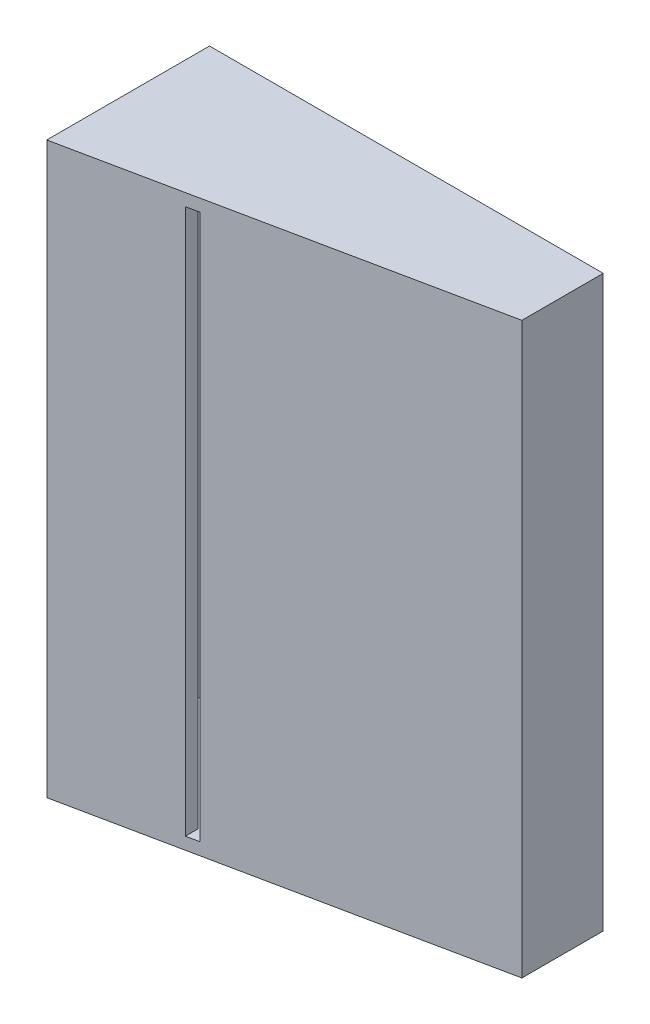
ISO-10303-21;
HEADER;
FILE_DESCRIPTION(('STEP AP214'),'2;1');
FILE_NAME('part.step','',(''),(''),'','','');
FILE_SCHEMA(('AUTOMOTIVE_DESIGN { 1 0 10303 214 1 1 1 1 }'));
ENDSEC;
DATA;
#1=APPLICATION_CONTEXT('core data for automotive mechanical design processes');
#2=APPLICATION_PROTOCOL_DEFINITION('international standard','automotive_design',2000,#1);
#3=PRODUCT_CONTEXT('',#1,'mechanical');
#4=PRODUCT('Part','Part','',(#3));
#5=PRODUCT_RELATED_PRODUCT_CATEGORY('part','',(#4));
#6=PRODUCT_DEFINITION_FORMATION('','',#4);
#7=PRODUCT_DEFINITION_CONTEXT('part definition',#1,'design');
#8=PRODUCT_DEFINITION('design','',#6,#7);
#9=PRODUCT_DEFINITION_SHAPE('','',#8);
#10=(LENGTH_UNIT() NAMED_UNIT(*) SI_UNIT(.MILLI.,.METRE.));
#11=(NAMED_UNIT(*) PLANE_ANGLE_UNIT() SI_UNIT($,.RADIAN.));
#12=(NAMED_UNIT(*) SI_UNIT($,.STERADIAN.) SOLID_ANGLE_UNIT());
#13=UNCERTAINTY_MEASURE_WITH_UNIT(LENGTH_MEASURE(1.E-05),#10,'distance_accuracy_value','');
#14=(GEOMETRIC_REPRESENTATION_CONTEXT(3) GLOBAL_UNCERTAINTY_ASSIGNED_CONTEXT((#13)) GLOBAL_UNIT_ASSIGNED_CONTEXT((#10,
#11,#12)) REPRESENTATION_CONTEXT('',''));
#15=CARTESIAN_POINT('',(0.,0.,0.));
#16=DIRECTION('',(0.,0.,1.));
#17=DIRECTION('',(1.,0.,0.));
#18=AXIS2_PLACEMENT_3D('',#15,#16,#17);
#19=CARTESIAN_POINT('',(0.,75.1134184450822,8.77829955942792));
#20=DIRECTION('',(0.202388113855783,0.,0.979305392290831));
#21=DIRECTION('',(0.979305392290831,0.,-0.202388113855783));
#22=AXIS2_PLACEMENT_3D('',#19,#20,#21);
#23=PLANE('',#22);
#24=DIRECTION('',(-0.979305392290831,0.,0.202388113855783));
#25=VECTOR('',#24,1.);
#26=CARTESIAN_POINT('',(0.,-8.25000000000003,8.77829955942792));
#27=LINE('',#26,#25);
#28=CARTESIAN_POINT('',(0.,-8.25000000000003,8.77829955942792));
#29=VERTEX_POINT('',#28);
#30=CARTESIAN_POINT('',(-31.27,-8.25000000000003,15.2407129905089));
#31=VERTEX_POINT('',#30);
#32=EDGE_CURVE('E264',#29,#31,#27,.T.);
#33=ORIENTED_EDGE('',*,*,#32,.T.);
#34=DIRECTION('',(0.,1.,0.));
#35=VECTOR('',#34,1.);
#36=CARTESIAN_POINT('',(-31.27,75.1134184450822,15.2407129905089));
#37=LINE('',#36,#35);
#38=CARTESIAN_POINT('',(-31.27,58.7499999999998,15.2407129905089));
#39=VERTEX_POINT('',#38);
#40=EDGE_CURVE('E242',#31,#39,#37,.T.);
#41=ORIENTED_EDGE('',*,*,#40,.T.);
#42=DIRECTION('',(-0.979305392290831,0.,0.202388113855783));
#43=VECTOR('',#42,1.);
#44=CARTESIAN_POINT('',(0.,58.7499999999998,8.77829955942792));
#45=LINE('',#44,#43);
#46=CARTESIAN_POINT('',(0.,58.7499999999998,8.77829955942792));
#47=VERTEX_POINT('',#46);
#48=EDGE_CURVE('E253',#47,#39,#45,.T.);
#49=ORIENTED_EDGE('',*,*,#48,.F.);
#50=DIRECTION('',(0.,-1.,0.));
#51=VECTOR('',#50,1.);
#52=CARTESIAN_POINT('',(0.,75.1134184450822,8.77829955942792));
#53=LINE('',#52,#51);
#54=EDGE_CURVE('E263',#47,#29,#53,.T.);
#55=ORIENTED_EDGE('',*,*,#54,.T.);
#56=EDGE_LOOP('',(#33,#41,#49,#55));
#57=FACE_BOUND('',#56,.T.);
#58=ADVANCED_FACE('F33',(#57),#23,.F.);
#59=CARTESIAN_POINT('',(-46.8874953737975,75.1134184450822,1.5));
#60=DIRECTION('',(0.,0.,-1.));
#61=DIRECTION('',(-1.,0.,0.));
#62=AXIS2_PLACEMENT_3D('',#59,#60,#61);
#63=PLANE('',#62);
#64=DIRECTION('',(1.,0.,0.));
#65=VECTOR('',#64,1.);
#66=CARTESIAN_POINT('',(-46.8874953737975,58.7499999999998,1.5));
#67=LINE('',#66,#65);
#68=CARTESIAN_POINT('',(-31.27,58.7499999999998,1.5));
#69=VERTEX_POINT('',#68);
#70=CARTESIAN_POINT('',(0.,58.7499999999998,1.5));
#71=VERTEX_POINT('',#70);
#72=EDGE_CURVE('E245',#69,#71,#67,.T.);
#73=ORIENTED_EDGE('',*,*,#72,.F.);
#74=DIRECTION('',(0.,-1.,0.));
#75=VECTOR('',#74,1.);
#76=CARTESIAN_POINT('',(-31.27,75.1134184450822,1.5));
#77=LINE('',#76,#75);
#78=CARTESIAN_POINT('',(-31.27,-8.25000000000002,1.5));
#79=VERTEX_POINT('',#78);
#80=EDGE_CURVE('E239',#69,#79,#77,.T.);
#81=ORIENTED_EDGE('',*,*,#80,.T.);
#82=DIRECTION('',(1.,0.,0.));
#83=VECTOR('',#82,1.);
#84=CARTESIAN_POINT('',(-46.8874953737975,-8.25000000000003,1.5));
#85=LINE('',#84,#83);
#86=CARTESIAN_POINT('',(0.,-8.25000000000003,1.5));
#87=VERTEX_POINT('',#86);
#88=EDGE_CURVE('E259',#79,#87,#85,.T.);
#89=ORIENTED_EDGE('',*,*,#88,.T.);
#90=DIRECTION('',(0.,-1.,0.));
#91=VECTOR('',#90,1.);
#92=CARTESIAN_POINT('',(0.,75.1134184450822,1.5));
#93=LINE('',#92,#91);
#94=EDGE_CURVE('E275',#71,#87,#93,.T.);
#95=ORIENTED_EDGE('',*,*,#94,.F.);
#96=EDGE_LOOP('',(#73,#81,#89,#95));
#97=FACE_BOUND('',#96,.T.);
#98=ADVANCED_FACE('F425',(#97),#63,.F.);
#99=CARTESIAN_POINT('',(-46.8874953737956,15.3499999999999,-21.511246837716));
#100=DIRECTION('',(-1.,0.,0.));
#101=DIRECTION('',(0.,-1.,0.));
#102=AXIS2_PLACEMENT_3D('',#99,#100,#101);
#103=PLANE('',#102);
#104=DIRECTION('',(0.,0.,1.));
#105=VECTOR('',#104,1.);
#106=CARTESIAN_POINT('',(-46.8874953737956,35.1499999999999,-21.511246837716));
#107=LINE('',#106,#105);
#108=CARTESIAN_POINT('',(-46.8874953737956,35.1499999999999,-1.49999999999997));
#109=VERTEX_POINT('',#108);
#110=CARTESIAN_POINT('',(-46.8874953737956,35.1499999999999,0.));
#111=VERTEX_POINT('',#110);
#112=EDGE_CURVE('E37',#109,#111,#107,.T.);
#113=ORIENTED_EDGE('',*,*,#112,.F.);
#114=DIRECTION('',(0.,1.,0.));
#115=VECTOR('',#114,1.);
#116=CARTESIAN_POINT('',(-46.8874953737956,12.2499999999999,-1.49999999999997));
#117=LINE('',#116,#115);
#118=CARTESIAN_POINT('',(-46.8874953737956,38.2499999999999,-1.49999999999997));
#119=VERTEX_POINT('',#118);
#120=EDGE_CURVE('E314',#109,#119,#117,.T.);
#121=ORIENTED_EDGE('',*,*,#120,.T.);
#122=DIRECTION('',(0.,0.,1.));
#123=VECTOR('',#122,1.);
#124=CARTESIAN_POINT('',(-46.8874953737956,38.2499999999999,-2.99999999999997));
#125=LINE('',#124,#123);
#126=CARTESIAN_POINT('',(-46.8874953737956,38.2499999999999,-2.99999999999997));
#127=VERTEX_POINT('',#126);
#128=EDGE_CURVE('E342',#127,#119,#125,.T.);
#129=ORIENTED_EDGE('',*,*,#128,.F.);
#130=DIRECTION('',(0.,1.,0.));
#131=VECTOR('',#130,1.);
#132=CARTESIAN_POINT('',(-46.8874953737956,12.2499999999999,-2.99999999999997));
#133=LINE('',#132,#131);
#134=CARTESIAN_POINT('',(-46.8874953737956,12.2499999999999,-2.99999999999997));
#135=VERTEX_POINT('',#134);
#136=EDGE_CURVE('E315',#135,#127,#133,.T.);
#137=ORIENTED_EDGE('',*,*,#136,.F.);
#138=DIRECTION('',(0.,0.,1.));
#139=VECTOR('',#138,1.);
#140=CARTESIAN_POINT('',(-46.8874953737956,12.2499999999999,-2.99999999999997));
#141=LINE('',#140,#139);
#142=CARTESIAN_POINT('',(-46.8874953737956,12.2499999999999,-1.49999999999997));
#143=VERTEX_POINT('',#142);
#144=EDGE_CURVE('E325',#135,#143,#141,.T.);
#145=ORIENTED_EDGE('',*,*,#144,.T.);
#146=CARTESIAN_POINT('',(-46.8874953737956,15.3499999999999,-1.49999999999997));
#147=VERTEX_POINT('',#146);
#148=EDGE_CURVE('E326',#143,#147,#117,.T.);
#149=ORIENTED_EDGE('',*,*,#148,.T.);
#150=DIRECTION('',(0.,0.,1.));
#151=VECTOR('',#150,1.);
#152=CARTESIAN_POINT('',(-46.8874953737956,15.3499999999999,-21.511246837716));
#153=LINE('',#152,#151);
#154=CARTESIAN_POINT('',(-46.8874953737956,15.3499999999999,0.));
#155=VERTEX_POINT('',#154);
#156=EDGE_CURVE('E363',#147,#155,#153,.T.);
#157=ORIENTED_EDGE('',*,*,#156,.T.);
#158=DIRECTION('',(0.,-1.,0.));
#159=VECTOR('',#158,1.);
#160=CARTESIAN_POINT('',(-46.8874953737956,15.2499999999999,0.));
#161=LINE('',#160,#159);
#162=CARTESIAN_POINT('',(-46.8874953737975,-9.75000000000003,0.));
#163=VERTEX_POINT('',#162);
#164=EDGE_CURVE('E302',#155,#163,#161,.T.);
#165=ORIENTED_EDGE('',*,*,#164,.T.);
#166=DIRECTION('',(0.,0.,-1.));
#167=VECTOR('',#166,1.);
#168=CARTESIAN_POINT('',(-46.8874953737975,-9.75000000000003,20.));
#169=LINE('',#168,#167);
#170=CARTESIAN_POINT('',(-46.8874953737975,-9.75000000000003,20.));
#171=VERTEX_POINT('',#170);
#172=EDGE_CURVE('E311',#171,#163,#169,.T.);
#173=ORIENTED_EDGE('',*,*,#172,.F.);
#174=DIRECTION('',(0.,-1.,0.));
#175=VECTOR('',#174,1.);
#176=CARTESIAN_POINT('',(-46.8874953737956,15.2499999999999,20.));
#177=LINE('',#176,#175);
#178=CARTESIAN_POINT('',(-46.8874953737966,60.2499999999998,20.));
#179=VERTEX_POINT('',#178);
#180=EDGE_CURVE('E290',#179,#171,#177,.T.);
#181=ORIENTED_EDGE('',*,*,#180,.F.);
#182=DIRECTION('',(0.,0.,-1.));
#183=VECTOR('',#182,1.);
#184=CARTESIAN_POINT('',(-46.8874953737966,60.2499999999998,20.));
#185=LINE('',#184,#183);
#186=CARTESIAN_POINT('',(-46.8874953737966,60.2499999999998,0.));
#187=VERTEX_POINT('',#186);
#188=EDGE_CURVE('E292',#179,#187,#185,.T.);
#189=ORIENTED_EDGE('',*,*,#188,.T.);
#190=EDGE_CURVE('E293',#187,#111,#161,.T.);
#191=ORIENTED_EDGE('',*,*,#190,.T.);
#192=EDGE_LOOP('',(#113,#121,#129,#137,#145,#149,#157,#165,#173,#181,#189,#191));
#193=FACE_BOUND('',#192,.T.);
#194=DIRECTION('',(0.,0.,-1.));
#195=VECTOR('',#194,1.);
#196=CARTESIAN_POINT('',(-46.8874953737975,58.7499999999998,18.4683021131017));
#197=LINE('',#196,#195);
#198=CARTESIAN_POINT('',(-46.8874953737975,58.7499999999998,18.4683021131017));
#199=VERTEX_POINT('',#198);
#200=CARTESIAN_POINT('',(-46.8874953737975,58.7499999999998,1.5));
#201=VERTEX_POINT('',#200);
#202=EDGE_CURVE('E249',#199,#201,#197,.T.);
#203=ORIENTED_EDGE('',*,*,#202,.F.);
#204=DIRECTION('',(0.,-1.,0.));
#205=VECTOR('',#204,1.);
#206=CARTESIAN_POINT('',(-46.8874953737975,75.1134184450822,18.4683021131017));
#207=LINE('',#206,#205);
#208=CARTESIAN_POINT('',(-46.8874953737975,-8.25000000000003,18.4683021131017));
#209=VERTEX_POINT('',#208);
#210=EDGE_CURVE('E276',#199,#209,#207,.T.);
#211=ORIENTED_EDGE('',*,*,#210,.T.);
#212=DIRECTION('',(0.,0.,-1.));
#213=VECTOR('',#212,1.);
#214=CARTESIAN_POINT('',(-46.8874953737975,-8.25000000000003,18.4683021131017));
#215=LINE('',#214,#213);
#216=CARTESIAN_POINT('',(-46.8874953737975,-8.25000000000003,1.5));
#217=VERTEX_POINT('',#216);
#218=EDGE_CURVE('E260',#209,#217,#215,.T.);
#219=ORIENTED_EDGE('',*,*,#218,.T.);
#220=DIRECTION('',(0.,-1.,0.));
#221=VECTOR('',#220,1.);
#222=CARTESIAN_POINT('',(-46.8874953737975,75.1134184450822,1.5));
#223=LINE('',#222,#221);
#224=EDGE_CURVE('E273',#201,#217,#223,.T.);
#225=ORIENTED_EDGE('',*,*,#224,.F.);
#226=EDGE_LOOP('',(#203,#211,#219,#225));
#227=FACE_BOUND('',#226,.T.);
#228=ADVANCED_FACE('F372',(#193,#227),#103,.T.);
#229=CARTESIAN_POINT('',(-46.8874953737956,35.1499999999999,-21.511246837716));
#230=DIRECTION('',(0.,1.,0.));
#231=DIRECTION('',(0.,0.,1.));
#232=AXIS2_PLACEMENT_3D('',#229,#230,#231);
#233=PLANE('',#232);
#234=DIRECTION('',(1.,0.,0.));
#235=VECTOR('',#234,1.);
#236=CARTESIAN_POINT('',(-46.8874953737956,35.1499999999999,-1.49999999999997));
#237=LINE('',#236,#235);
#238=CARTESIAN_POINT('',(-43.9874953737956,35.1499999999999,-1.49999999999997));
#239=VERTEX_POINT('',#238);
#240=EDGE_CURVE('E11',#109,#239,#237,.T.);
#241=ORIENTED_EDGE('',*,*,#240,.F.);
#242=ORIENTED_EDGE('',*,*,#112,.T.);
#243=DIRECTION('',(-1.,0.,0.));
#244=VECTOR('',#243,1.);
#245=CARTESIAN_POINT('',(-46.8874953737956,35.1499999999999,0.));
#246=LINE('',#245,#244);
#247=CARTESIAN_POINT('',(-43.9874953737956,35.1499999999999,0.));
#248=VERTEX_POINT('',#247);
#249=EDGE_CURVE('E345',#248,#111,#246,.T.);
#250=ORIENTED_EDGE('',*,*,#249,.F.);
#251=DIRECTION('',(0.,0.,1.));
#252=VECTOR('',#251,1.);
#253=CARTESIAN_POINT('',(-43.9874953737956,35.1499999999999,-21.511246837716));
#254=LINE('',#253,#252);
#255=EDGE_CURVE('E349',#239,#248,#254,.T.);
#256=ORIENTED_EDGE('',*,*,#255,.F.);
#257=EDGE_LOOP('',(#241,#242,#250,#256));
#258=FACE_BOUND('',#257,.T.);
#259=ADVANCED_FACE('F35',(#258),#233,.T.);
#260=CARTESIAN_POINT('',(-43.9874953737956,35.1499999999999,-21.511246837716));
#261=DIRECTION('',(1.,0.,0.));
#262=DIRECTION('',(0.,0.,-1.));
#263=AXIS2_PLACEMENT_3D('',#260,#261,#262);
#264=PLANE('',#263);
#265=DIRECTION('',(0.,-1.,0.));
#266=VECTOR('',#265,1.);
#267=CARTESIAN_POINT('',(-43.9874953737956,35.1499999999999,-1.49999999999997));
#268=LINE('',#267,#266);
#269=CARTESIAN_POINT('',(-43.9874953737956,15.3499999999999,-1.49999999999997));
#270=VERTEX_POINT('',#269);
#271=EDGE_CURVE('E42',#239,#270,#268,.T.);
#272=ORIENTED_EDGE('',*,*,#271,.F.);
#273=ORIENTED_EDGE('',*,*,#255,.T.);
#274=DIRECTION('',(0.,1.,0.));
#275=VECTOR('',#274,1.);
#276=CARTESIAN_POINT('',(-43.9874953737956,35.1499999999999,0.));
#277=LINE('',#276,#275);
#278=CARTESIAN_POINT('',(-43.9874953737956,15.3499999999999,0.));
#279=VERTEX_POINT('',#278);
#280=EDGE_CURVE('E357',#279,#248,#277,.T.);
#281=ORIENTED_EDGE('',*,*,#280,.F.);
#282=DIRECTION('',(0.,0.,1.));
#283=VECTOR('',#282,1.);
#284=CARTESIAN_POINT('',(-43.9874953737956,15.3499999999999,-21.511246837716));
#285=LINE('',#284,#283);
#286=EDGE_CURVE('E362',#270,#279,#285,.T.);
#287=ORIENTED_EDGE('',*,*,#286,.F.);
#288=EDGE_LOOP('',(#272,#273,#281,#287));
#289=FACE_BOUND('',#288,.T.);
#290=ADVANCED_FACE('F394',(#289),#264,.T.);
#291=CARTESIAN_POINT('',(-43.9874953737956,15.3499999999999,-21.511246837716));
#292=DIRECTION('',(0.,-1.,0.));
#293=DIRECTION('',(1.,0.,0.));
#294=AXIS2_PLACEMENT_3D('',#291,#292,#293);
#295=PLANE('',#294);
#296=DIRECTION('',(-1.,0.,0.));
#297=VECTOR('',#296,1.);
#298=CARTESIAN_POINT('',(-43.9874953737956,15.3499999999999,-1.49999999999997));
#299=LINE('',#298,#297);
#300=EDGE_CURVE('E346',#270,#147,#299,.T.);
#301=ORIENTED_EDGE('',*,*,#300,.F.);
#302=ORIENTED_EDGE('',*,*,#286,.T.);
#303=DIRECTION('',(1.,0.,0.));
#304=VECTOR('',#303,1.);
#305=CARTESIAN_POINT('',(-43.9874953737956,15.3499999999999,0.));
#306=LINE('',#305,#304);
#307=EDGE_CURVE('E354',#155,#279,#306,.T.);
#308=ORIENTED_EDGE('',*,*,#307,.F.);
#309=ORIENTED_EDGE('',*,*,#156,.F.);
#310=EDGE_LOOP('',(#301,#302,#308,#309));
#311=FACE_BOUND('',#310,.T.);
#312=ADVANCED_FACE('F391',(#311),#295,.T.);
#313=CARTESIAN_POINT('',(-24.387495373797,38.2499999999999,-2.99999999999997));
#314=DIRECTION('',(0.,-1.,0.));
#315=DIRECTION('',(0.,0.,-1.));
#316=AXIS2_PLACEMENT_3D('',#313,#314,#315);
#317=PLANE('',#316);
#318=DIRECTION('',(1.,0.,0.));
#319=VECTOR('',#318,1.);
#320=CARTESIAN_POINT('',(-24.387495373797,38.2499999999999,-1.49999999999997));
#321=LINE('',#320,#319);
#322=CARTESIAN_POINT('',(-24.387495373797,38.2499999999999,-1.49999999999997));
#323=VERTEX_POINT('',#322);
#324=EDGE_CURVE('E329',#119,#323,#321,.T.);
#325=ORIENTED_EDGE('',*,*,#324,.T.);
#326=DIRECTION('',(0.,0.,1.));
#327=VECTOR('',#326,1.);
#328=CARTESIAN_POINT('',(-24.387495373797,38.2499999999999,-2.99999999999997));
#329=LINE('',#328,#327);
#330=CARTESIAN_POINT('',(-24.387495373797,38.2499999999999,-2.99999999999997));
#331=VERTEX_POINT('',#330);
#332=EDGE_CURVE('E339',#331,#323,#329,.T.);
#333=ORIENTED_EDGE('',*,*,#332,.F.);
#334=DIRECTION('',(1.,0.,0.));
#335=VECTOR('',#334,1.);
#336=CARTESIAN_POINT('',(-24.387495373797,38.2499999999999,-2.99999999999997));
#337=LINE('',#336,#335);
#338=EDGE_CURVE('E318',#127,#331,#337,.T.);
#339=ORIENTED_EDGE('',*,*,#338,.F.);
#340=ORIENTED_EDGE('',*,*,#128,.T.);
#341=EDGE_LOOP('',(#325,#333,#339,#340));
#342=FACE_BOUND('',#341,.T.);
#343=ADVANCED_FACE('F402',(#342),#317,.F.);
#344=CARTESIAN_POINT('',(-24.387495373797,12.2499999999999,-2.99999999999997));
#345=DIRECTION('',(-1.,0.,0.));
#346=DIRECTION('',(0.,0.,1.));
#347=AXIS2_PLACEMENT_3D('',#344,#345,#346);
#348=PLANE('',#347);
#349=DIRECTION('',(0.,-1.,0.));
#350=VECTOR('',#349,1.);
#351=CARTESIAN_POINT('',(-24.387495373797,12.2499999999999,-1.49999999999997));
#352=LINE('',#351,#350);
#353=CARTESIAN_POINT('',(-24.387495373797,12.2499999999999,-1.49999999999997));
#354=VERTEX_POINT('',#353);
#355=EDGE_CURVE('E331',#323,#354,#352,.T.);
#356=ORIENTED_EDGE('',*,*,#355,.T.);
#357=DIRECTION('',(0.,0.,1.));
#358=VECTOR('',#357,1.);
#359=CARTESIAN_POINT('',(-24.387495373797,12.2499999999999,-2.99999999999997));
#360=LINE('',#359,#358);
#361=CARTESIAN_POINT('',(-24.387495373797,12.2499999999999,-2.99999999999997));
#362=VERTEX_POINT('',#361);
#363=EDGE_CURVE('E336',#362,#354,#360,.T.);
#364=ORIENTED_EDGE('',*,*,#363,.F.);
#365=DIRECTION('',(0.,-1.,0.));
#366=VECTOR('',#365,1.);
#367=CARTESIAN_POINT('',(-24.387495373797,12.2499999999999,-2.99999999999997));
#368=LINE('',#367,#366);
#369=EDGE_CURVE('E321',#331,#362,#368,.T.);
#370=ORIENTED_EDGE('',*,*,#369,.F.);
#371=ORIENTED_EDGE('',*,*,#332,.T.);
#372=EDGE_LOOP('',(#356,#364,#370,#371));
#373=FACE_BOUND('',#372,.T.);
#374=ADVANCED_FACE('F415',(#373),#348,.F.);
#375=CARTESIAN_POINT('',(-24.387495373797,12.2499999999999,-2.99999999999997));
#376=DIRECTION('',(0.,1.,0.));
#377=DIRECTION('',(0.,0.,1.));
#378=AXIS2_PLACEMENT_3D('',#375,#376,#377);
#379=PLANE('',#378);
#380=DIRECTION('',(-1.,0.,0.));
#381=VECTOR('',#380,1.);
#382=CARTESIAN_POINT('',(-24.387495373797,12.2499999999999,-1.49999999999997));
#383=LINE('',#382,#381);
#384=EDGE_CURVE('E319',#354,#143,#383,.T.);
#385=ORIENTED_EDGE('',*,*,#384,.T.);
#386=ORIENTED_EDGE('',*,*,#144,.F.);
#387=DIRECTION('',(-1.,0.,0.));
#388=VECTOR('',#387,1.);
#389=CARTESIAN_POINT('',(-24.387495373797,12.2499999999999,-2.99999999999997));
#390=LINE('',#389,#388);
#391=EDGE_CURVE('E323',#362,#135,#390,.T.);
#392=ORIENTED_EDGE('',*,*,#391,.F.);
#393=ORIENTED_EDGE('',*,*,#363,.T.);
#394=EDGE_LOOP('',(#385,#386,#392,#393));
#395=FACE_BOUND('',#394,.T.);
#396=ADVANCED_FACE('F411',(#395),#379,.F.);
#397=CARTESIAN_POINT('',(0.,0.,-2.99999999999997));
#398=DIRECTION('',(0.,0.,1.));
#399=DIRECTION('',(1.,0.,0.));
#400=AXIS2_PLACEMENT_3D('',#397,#398,#399);
#401=PLANE('',#400);
#402=ORIENTED_EDGE('',*,*,#136,.T.);
#403=ORIENTED_EDGE('',*,*,#338,.T.);
#404=ORIENTED_EDGE('',*,*,#369,.T.);
#405=ORIENTED_EDGE('',*,*,#391,.T.);
#406=EDGE_LOOP('',(#402,#403,#404,#405));
#407=FACE_BOUND('',#406,.T.);
#408=ADVANCED_FACE('F406',(#407),#401,.F.);
#409=CARTESIAN_POINT('',(0.,0.,-1.49999999999997));
#410=DIRECTION('',(0.,0.,1.));
#411=DIRECTION('',(1.,0.,0.));
#412=AXIS2_PLACEMENT_3D('',#409,#410,#411);
#413=PLANE('',#412);
#414=ORIENTED_EDGE('',*,*,#120,.F.);
#415=ORIENTED_EDGE('',*,*,#240,.T.);
#416=ORIENTED_EDGE('',*,*,#271,.T.);
#417=ORIENTED_EDGE('',*,*,#300,.T.);
#418=ORIENTED_EDGE('',*,*,#148,.F.);
#419=ORIENTED_EDGE('',*,*,#384,.F.);
#420=ORIENTED_EDGE('',*,*,#355,.F.);
#421=ORIENTED_EDGE('',*,*,#324,.F.);
#422=EDGE_LOOP('',(#414,#415,#416,#417,#418,#419,#420,#421));
#423=FACE_BOUND('',#422,.T.);
#424=ADVANCED_FACE('F396',(#423),#413,.T.);
#425=CARTESIAN_POINT('',(0.,0.,0.));
#426=DIRECTION('',(0.,0.,1.));
#427=DIRECTION('',(1.,0.,0.));
#428=AXIS2_PLACEMENT_3D('',#425,#426,#427);
#429=PLANE('',#428);
#430=DIRECTION('',(-1.,0.,0.));
#431=VECTOR('',#430,1.);
#432=CARTESIAN_POINT('',(-32.77,-8.25000000000002,0.));
#433=LINE('',#432,#431);
#434=CARTESIAN_POINT('',(-31.27,-8.25000000000002,0.));
#435=VERTEX_POINT('',#434);
#436=CARTESIAN_POINT('',(-32.77,-8.25000000000002,0.));
#437=VERTEX_POINT('',#436);
#438=EDGE_CURVE('E209',#435,#437,#433,.T.);
#439=ORIENTED_EDGE('',*,*,#438,.F.);
#440=DIRECTION('',(0.,-1.,0.));
#441=VECTOR('',#440,1.);
#442=CARTESIAN_POINT('',(-31.27,58.7499999999998,0.));
#443=LINE('',#442,#441);
#444=CARTESIAN_POINT('',(-31.27,58.7499999999998,0.));
#445=VERTEX_POINT('',#444);
#446=EDGE_CURVE('E50',#445,#435,#443,.T.);
#447=ORIENTED_EDGE('',*,*,#446,.F.);
#448=DIRECTION('',(1.,0.,0.));
#449=VECTOR('',#448,1.);
#450=CARTESIAN_POINT('',(-32.77,58.7499999999998,0.));
#451=LINE('',#450,#449);
#452=CARTESIAN_POINT('',(-32.77,58.7499999999998,0.));
#453=VERTEX_POINT('',#452);
#454=EDGE_CURVE('E218',#453,#445,#451,.T.);
#455=ORIENTED_EDGE('',*,*,#454,.F.);
#456=DIRECTION('',(0.,1.,0.));
#457=VECTOR('',#456,1.);
#458=CARTESIAN_POINT('',(-32.77,58.7499999999998,0.));
#459=LINE('',#458,#457);
#460=EDGE_CURVE('E200',#437,#453,#459,.T.);
#461=ORIENTED_EDGE('',*,*,#460,.F.);
#462=EDGE_LOOP('',(#439,#447,#455,#461));
#463=FACE_BOUND('',#462,.T.);
#464=ORIENTED_EDGE('',*,*,#280,.T.);
#465=ORIENTED_EDGE('',*,*,#249,.T.);
#466=ORIENTED_EDGE('',*,*,#190,.F.);
#467=DIRECTION('',(-1.,0.,0.));
#468=VECTOR('',#467,1.);
#469=CARTESIAN_POINT('',(1.5,60.2499999999998,0.));
#470=LINE('',#469,#468);
#471=CARTESIAN_POINT('',(1.5,60.2499999999998,0.));
#472=VERTEX_POINT('',#471);
#473=EDGE_CURVE('E299',#472,#187,#470,.T.);
#474=ORIENTED_EDGE('',*,*,#473,.F.);
#475=DIRECTION('',(0.,1.,0.));
#476=VECTOR('',#475,1.);
#477=CARTESIAN_POINT('',(1.5,-9.75000000000003,0.));
#478=LINE('',#477,#476);
#479=CARTESIAN_POINT('',(1.5,-9.75000000000003,0.));
#480=VERTEX_POINT('',#479);
#481=EDGE_CURVE('E296',#480,#472,#478,.T.);
#482=ORIENTED_EDGE('',*,*,#481,.F.);
#483=DIRECTION('',(1.,0.,0.));
#484=VECTOR('',#483,1.);
#485=CARTESIAN_POINT('',(-46.8874953737975,-9.75000000000003,0.));
#486=LINE('',#485,#484);
#487=EDGE_CURVE('E289',#163,#480,#486,.T.);
#488=ORIENTED_EDGE('',*,*,#487,.F.);
#489=ORIENTED_EDGE('',*,*,#164,.F.);
#490=ORIENTED_EDGE('',*,*,#307,.T.);
#491=EDGE_LOOP('',(#464,#465,#466,#474,#482,#488,#489,#490));
#492=FACE_BOUND('',#491,.T.);
#493=ADVANCED_FACE('F215',(#463,#492),#429,.F.);
#494=CARTESIAN_POINT('',(-46.8874953737975,-9.75000000000003,20.));
#495=DIRECTION('',(0.,1.,0.));
#496=DIRECTION('',(0.,0.,1.));
#497=AXIS2_PLACEMENT_3D('',#494,#495,#496);
#498=PLANE('',#497);
#499=DIRECTION('',(0.,0.,-1.));
#500=VECTOR('',#499,1.);
#501=CARTESIAN_POINT('',(1.5,-9.75000000000003,20.));
#502=LINE('',#501,#500);
#503=CARTESIAN_POINT('',(1.5,-9.75000000000003,10.));
#504=VERTEX_POINT('',#503);
#505=EDGE_CURVE('E309',#504,#480,#502,.T.);
#506=ORIENTED_EDGE('',*,*,#505,.F.);
#507=DIRECTION('',(0.979305392290831,0.,-0.202388113855783));
#508=VECTOR('',#507,1.);
#509=CARTESIAN_POINT('',(-46.8874953737975,-9.75000000000003,20.));
#510=LINE('',#509,#508);
#511=EDGE_CURVE('E282',#171,#504,#510,.T.);
#512=ORIENTED_EDGE('',*,*,#511,.F.);
#513=ORIENTED_EDGE('',*,*,#172,.T.);
#514=ORIENTED_EDGE('',*,*,#487,.T.);
#515=EDGE_LOOP('',(#506,#512,#513,#514));
#516=FACE_BOUND('',#515,.T.);
#517=ADVANCED_FACE('F389',(#516),#498,.F.);
#518=CARTESIAN_POINT('',(1.5,-9.75000000000003,20.));
#519=DIRECTION('',(-1.,0.,0.));
#520=DIRECTION('',(0.,0.,1.));
#521=AXIS2_PLACEMENT_3D('',#518,#519,#520);
#522=PLANE('',#521);
#523=DIRECTION('',(0.,0.,-1.));
#524=VECTOR('',#523,1.);
#525=CARTESIAN_POINT('',(1.5,60.2499999999998,20.));
#526=LINE('',#525,#524);
#527=CARTESIAN_POINT('',(1.5,60.2499999999998,10.));
#528=VERTEX_POINT('',#527);
#529=EDGE_CURVE('E307',#528,#472,#526,.T.);
#530=ORIENTED_EDGE('',*,*,#529,.F.);
#531=DIRECTION('',(0.,-1.,0.));
#532=VECTOR('',#531,1.);
#533=CARTESIAN_POINT('',(1.5,109.660016277565,10.));
#534=LINE('',#533,#532);
#535=EDGE_CURVE('E284',#528,#504,#534,.T.);
#536=ORIENTED_EDGE('',*,*,#535,.T.);
#537=ORIENTED_EDGE('',*,*,#505,.T.);
#538=ORIENTED_EDGE('',*,*,#481,.T.);
#539=EDGE_LOOP('',(#530,#536,#537,#538));
#540=FACE_BOUND('',#539,.T.);
#541=ADVANCED_FACE('F385',(#540),#522,.F.);
#542=CARTESIAN_POINT('',(1.5,60.2499999999998,20.));
#543=DIRECTION('',(0.,-1.,0.));
#544=DIRECTION('',(0.,0.,-1.));
#545=AXIS2_PLACEMENT_3D('',#542,#543,#544);
#546=PLANE('',#545);
#547=ORIENTED_EDGE('',*,*,#188,.F.);
#548=DIRECTION('',(-0.979305392290831,0.,0.202388113855783));
#549=VECTOR('',#548,1.);
#550=CARTESIAN_POINT('',(-46.8874953737975,60.2499999999998,20.));
#551=LINE('',#550,#549);
#552=EDGE_CURVE('E287',#528,#179,#551,.T.);
#553=ORIENTED_EDGE('',*,*,#552,.F.);
#554=ORIENTED_EDGE('',*,*,#529,.T.);
#555=ORIENTED_EDGE('',*,*,#473,.T.);
#556=EDGE_LOOP('',(#547,#553,#554,#555));
#557=FACE_BOUND('',#556,.T.);
#558=ADVANCED_FACE('F379',(#557),#546,.F.);
#559=CARTESIAN_POINT('',(-46.8874953737975,109.660016277565,20.));
#560=DIRECTION('',(-0.202388113855783,0.,-0.979305392290831));
#561=DIRECTION('',(-0.979305392290831,0.,0.202388113855783));
#562=AXIS2_PLACEMENT_3D('',#559,#560,#561);
#563=PLANE('',#562);
#564=DIRECTION('',(-0.979305392290831,0.,0.202388113855783));
#565=VECTOR('',#564,1.);
#566=CARTESIAN_POINT('',(-46.1623361622932,58.7499999999998,19.8501349975025));
#567=LINE('',#566,#565);
#568=CARTESIAN_POINT('',(-31.27,58.7499999999998,16.7724108774073));
#569=VERTEX_POINT('',#568);
#570=CARTESIAN_POINT('',(-32.77,58.7499999999998,17.0824083237335));
#571=VERTEX_POINT('',#570);
#572=EDGE_CURVE('E454',#569,#571,#567,.T.);
#573=ORIENTED_EDGE('',*,*,#572,.F.);
#574=DIRECTION('',(0.,1.,0.));
#575=VECTOR('',#574,1.);
#576=CARTESIAN_POINT('',(-31.27,58.7499999999998,16.7724108774073));
#577=LINE('',#576,#575);
#578=CARTESIAN_POINT('',(-31.27,-8.25000000000002,16.7724108774073));
#579=VERTEX_POINT('',#578);
#580=EDGE_CURVE('E234',#579,#569,#577,.T.);
#581=ORIENTED_EDGE('',*,*,#580,.F.);
#582=DIRECTION('',(0.979305392290831,0.,-0.202388113855783));
#583=VECTOR('',#582,1.);
#584=CARTESIAN_POINT('',(-46.1623361622932,-8.25000000000002,19.8501349975025));
#585=LINE('',#584,#583);
#586=CARTESIAN_POINT('',(-32.77,-8.25000000000002,17.0824083237335));
#587=VERTEX_POINT('',#586);
#588=EDGE_CURVE('E232',#587,#579,#585,.T.);
#589=ORIENTED_EDGE('',*,*,#588,.F.);
#590=DIRECTION('',(0.,-1.,0.));
#591=VECTOR('',#590,1.);
#592=CARTESIAN_POINT('',(-32.77,58.7499999999998,17.0824083237335));
#593=LINE('',#592,#591);
#594=EDGE_CURVE('E225',#571,#587,#593,.T.);
#595=ORIENTED_EDGE('',*,*,#594,.F.);
#596=EDGE_LOOP('',(#573,#581,#589,#595));
#597=FACE_BOUND('',#596,.T.);
#598=ORIENTED_EDGE('',*,*,#552,.T.);
#599=ORIENTED_EDGE('',*,*,#180,.T.);
#600=ORIENTED_EDGE('',*,*,#511,.T.);
#601=ORIENTED_EDGE('',*,*,#535,.F.);
#602=EDGE_LOOP('',(#598,#599,#600,#601));
#603=FACE_BOUND('',#602,.T.);
#604=ADVANCED_FACE('F460',(#597,#603),#563,.F.);
#605=CARTESIAN_POINT('',(0.,-8.25000000000003,0.));
#606=DIRECTION('',(0.,-1.,0.));
#607=DIRECTION('',(0.,0.,-1.));
#608=AXIS2_PLACEMENT_3D('',#605,#606,#607);
#609=PLANE('',#608);
#610=CARTESIAN_POINT('',(-32.77,-8.25000000000002,15.5507104368352));
#611=VERTEX_POINT('',#610);
#612=EDGE_CURVE('E267',#611,#209,#27,.T.);
#613=ORIENTED_EDGE('',*,*,#612,.F.);
#614=DIRECTION('',(0.,0.,-1.));
#615=VECTOR('',#614,1.);
#616=CARTESIAN_POINT('',(-32.77,-8.25000000000002,84.6522954072329));
#617=LINE('',#616,#615);
#618=EDGE_CURVE('E58',#587,#611,#617,.T.);
#619=ORIENTED_EDGE('',*,*,#618,.F.);
#620=ORIENTED_EDGE('',*,*,#588,.T.);
#621=DIRECTION('',(0.,0.,-1.));
#622=VECTOR('',#621,1.);
#623=CARTESIAN_POINT('',(-31.27,-8.25000000000002,84.6522954072329));
#624=LINE('',#623,#622);
#625=EDGE_CURVE('E206',#579,#31,#624,.T.);
#626=ORIENTED_EDGE('',*,*,#625,.T.);
#627=ORIENTED_EDGE('',*,*,#32,.F.);
#628=DIRECTION('',(0.,0.,1.));
#629=VECTOR('',#628,1.);
#630=CARTESIAN_POINT('',(0.,-8.25000000000003,1.5));
#631=LINE('',#630,#629);
#632=EDGE_CURVE('E268',#87,#29,#631,.T.);
#633=ORIENTED_EDGE('',*,*,#632,.F.);
#634=ORIENTED_EDGE('',*,*,#88,.F.);
#635=EDGE_CURVE('E212',#79,#435,#624,.T.);
#636=ORIENTED_EDGE('',*,*,#635,.T.);
#637=ORIENTED_EDGE('',*,*,#438,.T.);
#638=CARTESIAN_POINT('',(-32.77,-8.25000000000003,1.5));
#639=VERTEX_POINT('',#638);
#640=EDGE_CURVE('E196',#639,#437,#617,.T.);
#641=ORIENTED_EDGE('',*,*,#640,.F.);
#642=EDGE_CURVE('E271',#217,#639,#85,.T.);
#643=ORIENTED_EDGE('',*,*,#642,.F.);
#644=ORIENTED_EDGE('',*,*,#218,.F.);
#645=EDGE_LOOP('',(#613,#619,#620,#626,#627,#633,#634,#636,#637,#641,#643,#644));
#646=FACE_BOUND('',#645,.T.);
#647=ADVANCED_FACE('F210',(#646),#609,.F.);
#648=CARTESIAN_POINT('',(0.,75.1134184450822,1.5));
#649=DIRECTION('',(1.,0.,0.));
#650=DIRECTION('',(0.,0.,-1.));
#651=AXIS2_PLACEMENT_3D('',#648,#649,#650);
#652=PLANE('',#651);
#653=ORIENTED_EDGE('',*,*,#94,.T.);
#654=ORIENTED_EDGE('',*,*,#632,.T.);
#655=ORIENTED_EDGE('',*,*,#54,.F.);
#656=DIRECTION('',(0.,0.,1.));
#657=VECTOR('',#656,1.);
#658=CARTESIAN_POINT('',(0.,58.7499999999998,1.5));
#659=LINE('',#658,#657);
#660=EDGE_CURVE('E256',#71,#47,#659,.T.);
#661=ORIENTED_EDGE('',*,*,#660,.F.);
#662=EDGE_LOOP('',(#653,#654,#655,#661));
#663=FACE_BOUND('',#662,.T.);
#664=ADVANCED_FACE('F437',(#663),#652,.F.);
#665=CARTESIAN_POINT('',(-32.77,58.7499999999998,15.5507104368352));
#666=VERTEX_POINT('',#665);
#667=EDGE_CURVE('E252',#666,#199,#45,.T.);
#668=ORIENTED_EDGE('',*,*,#667,.F.);
#669=DIRECTION('',(0.,-1.,0.));
#670=VECTOR('',#669,1.);
#671=CARTESIAN_POINT('',(-32.77,75.1134184450822,15.5507104368352));
#672=LINE('',#671,#670);
#673=EDGE_CURVE('E236',#666,#611,#672,.T.);
#674=ORIENTED_EDGE('',*,*,#673,.T.);
#675=ORIENTED_EDGE('',*,*,#612,.T.);
#676=ORIENTED_EDGE('',*,*,#210,.F.);
#677=EDGE_LOOP('',(#668,#674,#675,#676));
#678=FACE_BOUND('',#677,.T.);
#679=ADVANCED_FACE('F428',(#678),#23,.F.);
#680=ORIENTED_EDGE('',*,*,#642,.T.);
#681=DIRECTION('',(0.,1.,0.));
#682=VECTOR('',#681,1.);
#683=CARTESIAN_POINT('',(-32.77,75.1134184450822,1.5));
#684=LINE('',#683,#682);
#685=CARTESIAN_POINT('',(-32.77,58.7499999999998,1.5));
#686=VERTEX_POINT('',#685);
#687=EDGE_CURVE('E203',#639,#686,#684,.T.);
#688=ORIENTED_EDGE('',*,*,#687,.T.);
#689=EDGE_CURVE('E246',#201,#686,#67,.T.);
#690=ORIENTED_EDGE('',*,*,#689,.F.);
#691=ORIENTED_EDGE('',*,*,#224,.T.);
#692=EDGE_LOOP('',(#680,#688,#690,#691));
#693=FACE_BOUND('',#692,.T.);
#694=ADVANCED_FACE('F434',(#693),#63,.F.);
#695=CARTESIAN_POINT('',(0.,58.7499999999998,0.));
#696=DIRECTION('',(0.,1.,0.));
#697=DIRECTION('',(0.,0.,-1.));
#698=AXIS2_PLACEMENT_3D('',#695,#696,#697);
#699=PLANE('',#698);
#700=ORIENTED_EDGE('',*,*,#689,.T.);
#701=DIRECTION('',(0.,0.,-1.));
#702=VECTOR('',#701,1.);
#703=CARTESIAN_POINT('',(-32.77,58.7499999999998,84.6522954072329));
#704=LINE('',#703,#702);
#705=EDGE_CURVE('E229',#686,#453,#704,.T.);
#706=ORIENTED_EDGE('',*,*,#705,.T.);
#707=ORIENTED_EDGE('',*,*,#454,.T.);
#708=DIRECTION('',(0.,0.,-1.));
#709=VECTOR('',#708,1.);
#710=CARTESIAN_POINT('',(-31.27,58.7499999999998,84.6522954072329));
#711=LINE('',#710,#709);
#712=EDGE_CURVE('E226',#69,#445,#711,.T.);
#713=ORIENTED_EDGE('',*,*,#712,.F.);
#714=ORIENTED_EDGE('',*,*,#72,.T.);
#715=ORIENTED_EDGE('',*,*,#660,.T.);
#716=ORIENTED_EDGE('',*,*,#48,.T.);
#717=EDGE_CURVE('E223',#569,#39,#711,.T.);
#718=ORIENTED_EDGE('',*,*,#717,.F.);
#719=ORIENTED_EDGE('',*,*,#572,.T.);
#720=EDGE_CURVE('E227',#571,#666,#704,.T.);
#721=ORIENTED_EDGE('',*,*,#720,.T.);
#722=ORIENTED_EDGE('',*,*,#667,.T.);
#723=ORIENTED_EDGE('',*,*,#202,.T.);
#724=EDGE_LOOP('',(#700,#706,#707,#713,#714,#715,#716,#718,#719,#721,#722,#723));
#725=FACE_BOUND('',#724,.T.);
#726=ADVANCED_FACE('F443',(#725),#699,.F.);
#727=CARTESIAN_POINT('',(-32.77,58.7499999999998,84.6522954072329));
#728=DIRECTION('',(-1.,0.,0.));
#729=DIRECTION('',(0.,0.,1.));
#730=AXIS2_PLACEMENT_3D('',#727,#728,#729);
#731=PLANE('',#730);
#732=ORIENTED_EDGE('',*,*,#640,.T.);
#733=ORIENTED_EDGE('',*,*,#460,.T.);
#734=ORIENTED_EDGE('',*,*,#705,.F.);
#735=ORIENTED_EDGE('',*,*,#687,.F.);
#736=EDGE_LOOP('',(#732,#733,#734,#735));
#737=FACE_BOUND('',#736,.T.);
#738=ADVANCED_FACE('F198',(#737),#731,.F.);
#739=CARTESIAN_POINT('',(-31.27,58.7499999999998,84.6522954072329));
#740=DIRECTION('',(1.,0.,0.));
#741=DIRECTION('',(0.,0.,-1.));
#742=AXIS2_PLACEMENT_3D('',#739,#740,#741);
#743=PLANE('',#742);
#744=ORIENTED_EDGE('',*,*,#712,.T.);
#745=ORIENTED_EDGE('',*,*,#446,.T.);
#746=ORIENTED_EDGE('',*,*,#635,.F.);
#747=ORIENTED_EDGE('',*,*,#80,.F.);
#748=EDGE_LOOP('',(#744,#745,#746,#747));
#749=FACE_BOUND('',#748,.T.);
#750=ADVANCED_FACE('F477',(#749),#743,.F.);
#751=ORIENTED_EDGE('',*,*,#625,.F.);
#752=ORIENTED_EDGE('',*,*,#580,.T.);
#753=ORIENTED_EDGE('',*,*,#717,.T.);
#754=ORIENTED_EDGE('',*,*,#40,.F.);
#755=EDGE_LOOP('',(#751,#752,#753,#754));
#756=FACE_BOUND('',#755,.T.);
#757=ADVANCED_FACE('F468',(#756),#743,.F.);
#758=ORIENTED_EDGE('',*,*,#720,.F.);
#759=ORIENTED_EDGE('',*,*,#594,.T.);
#760=ORIENTED_EDGE('',*,*,#618,.T.);
#761=ORIENTED_EDGE('',*,*,#673,.F.);
#762=EDGE_LOOP('',(#758,#759,#760,#761));
#763=FACE_BOUND('',#762,.T.);
#764=ADVANCED_FACE('F457',(#763),#731,.F.);
#765=CLOSED_SHELL('',(#58,#98,#228,#259,#290,#312,#343,#374,#396,#408,#424,#493,#517,#541,#558,
#604,#647,#664,#679,#694,#726,#738,#750,#757,#764));
#766=MANIFOLD_SOLID_BREP('B2',#765);
#767=ADVANCED_BREP_SHAPE_REPRESENTATION('',(#18,#766),#14);
#768=SHAPE_DEFINITION_REPRESENTATION(#9,#767);
ENDSEC;
END-ISO-10303-21;
